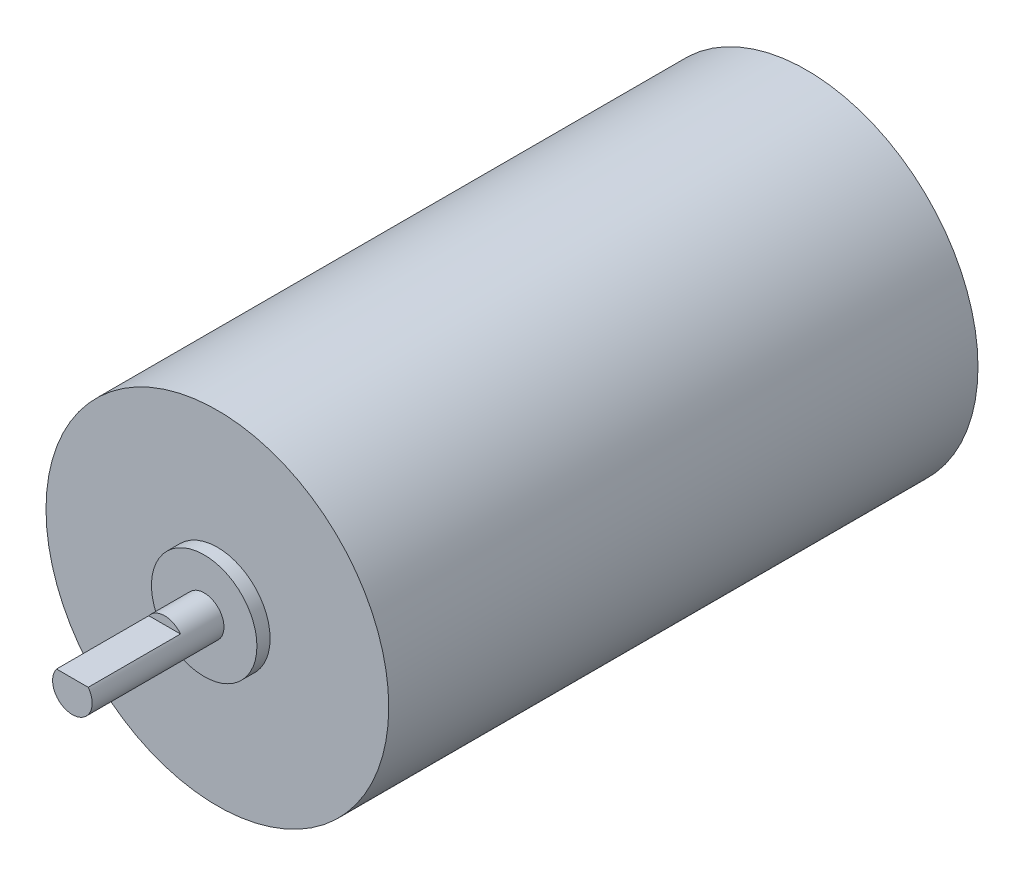
ISO-10303-21;
HEADER;
FILE_DESCRIPTION(('STEP AP214'),'2;1');
FILE_NAME('part.step','',(''),(''),'','','');
FILE_SCHEMA(('AUTOMOTIVE_DESIGN { 1 0 10303 214 1 1 1 1 }'));
ENDSEC;
DATA;
#1=APPLICATION_CONTEXT('core data for automotive mechanical design processes');
#2=APPLICATION_PROTOCOL_DEFINITION('international standard','automotive_design',2000,#1);
#3=PRODUCT_CONTEXT('',#1,'mechanical');
#4=PRODUCT('Part','Part','',(#3));
#5=PRODUCT_RELATED_PRODUCT_CATEGORY('part','',(#4));
#6=PRODUCT_DEFINITION_FORMATION('','',#4);
#7=PRODUCT_DEFINITION_CONTEXT('part definition',#1,'design');
#8=PRODUCT_DEFINITION('design','',#6,#7);
#9=PRODUCT_DEFINITION_SHAPE('','',#8);
#10=(LENGTH_UNIT() NAMED_UNIT(*) SI_UNIT(.MILLI.,.METRE.));
#11=(NAMED_UNIT(*) PLANE_ANGLE_UNIT() SI_UNIT($,.RADIAN.));
#12=(NAMED_UNIT(*) SI_UNIT($,.STERADIAN.) SOLID_ANGLE_UNIT());
#13=UNCERTAINTY_MEASURE_WITH_UNIT(LENGTH_MEASURE(1.E-05),#10,'distance_accuracy_value','');
#14=(GEOMETRIC_REPRESENTATION_CONTEXT(3) GLOBAL_UNCERTAINTY_ASSIGNED_CONTEXT((#13)) GLOBAL_UNIT_ASSIGNED_CONTEXT((#10,
#11,#12)) REPRESENTATION_CONTEXT('',''));
#15=CARTESIAN_POINT('',(0.,0.,0.));
#16=DIRECTION('',(0.,0.,1.));
#17=DIRECTION('',(1.,0.,0.));
#18=AXIS2_PLACEMENT_3D('',#15,#16,#17);
#19=CARTESIAN_POINT('',(0.,0.,45.7));
#20=DIRECTION('',(0.,0.,1.));
#21=DIRECTION('',(1.,0.,0.));
#22=AXIS2_PLACEMENT_3D('',#19,#20,#21);
#23=PLANE('',#22);
#24=CARTESIAN_POINT('',(0.,0.,45.7));
#25=DIRECTION('',(0.,0.,1.));
#26=DIRECTION('',(1.,0.,0.));
#27=AXIS2_PLACEMENT_3D('',#24,#25,#26);
#28=CIRCLE('',#27,4.);
#29=CARTESIAN_POINT('',(4.,0.,45.7));
#30=VERTEX_POINT('',#29);
#31=EDGE_CURVE('E77',#30,#30,#28,.T.);
#32=ORIENTED_EDGE('',*,*,#31,.T.);
#33=EDGE_LOOP('',(#32));
#34=FACE_BOUND('',#33,.T.);
#35=CARTESIAN_POINT('',(0.,0.,45.7));
#36=DIRECTION('',(0.,0.,1.));
#37=DIRECTION('',(1.,0.,0.));
#38=AXIS2_PLACEMENT_3D('',#35,#36,#37);
#39=CIRCLE('',#38,1.5);
#40=CARTESIAN_POINT('',(1.5,0.,45.7));
#41=VERTEX_POINT('',#40);
#42=EDGE_CURVE('E71',#41,#41,#39,.T.);
#43=ORIENTED_EDGE('',*,*,#42,.F.);
#44=EDGE_LOOP('',(#43));
#45=FACE_BOUND('',#44,.T.);
#46=ADVANCED_FACE('F33',(#34,#45),#23,.T.);
#47=CARTESIAN_POINT('',(0.,0.,44.7));
#48=DIRECTION('',(0.,0.,1.));
#49=DIRECTION('',(1.,0.,0.));
#50=AXIS2_PLACEMENT_3D('',#47,#48,#49);
#51=PLANE('',#50);
#52=CARTESIAN_POINT('',(0.,0.,44.7));
#53=DIRECTION('',(0.,0.,1.));
#54=DIRECTION('',(1.,0.,0.));
#55=AXIS2_PLACEMENT_3D('',#52,#53,#54);
#56=CIRCLE('',#55,13.);
#57=CARTESIAN_POINT('',(-13.,0.,44.7));
#58=VERTEX_POINT('',#57);
#59=EDGE_CURVE('E11',#58,#58,#56,.T.);
#60=ORIENTED_EDGE('',*,*,#59,.T.);
#61=EDGE_LOOP('',(#60));
#62=FACE_BOUND('',#61,.T.);
#63=CARTESIAN_POINT('',(0.,0.,44.7));
#64=DIRECTION('',(0.,0.,1.));
#65=DIRECTION('',(1.,0.,0.));
#66=AXIS2_PLACEMENT_3D('',#63,#64,#65);
#67=CIRCLE('',#66,4.);
#68=CARTESIAN_POINT('',(4.,0.,44.7));
#69=VERTEX_POINT('',#68);
#70=EDGE_CURVE('E74',#69,#69,#67,.T.);
#71=ORIENTED_EDGE('',*,*,#70,.F.);
#72=EDGE_LOOP('',(#71));
#73=FACE_BOUND('',#72,.T.);
#74=ADVANCED_FACE('F99',(#62,#73),#51,.T.);
#75=CARTESIAN_POINT('',(0.,0.,44.7));
#76=DIRECTION('',(0.,0.,-1.));
#77=DIRECTION('',(-1.,0.,0.));
#78=AXIS2_PLACEMENT_3D('',#75,#76,#77);
#79=CYLINDRICAL_SURFACE('',#78,13.);
#80=CARTESIAN_POINT('',(0.,0.,0.));
#81=DIRECTION('',(0.,0.,1.));
#82=DIRECTION('',(1.,0.,0.));
#83=AXIS2_PLACEMENT_3D('',#80,#81,#82);
#84=CIRCLE('',#83,13.);
#85=CARTESIAN_POINT('',(-13.,0.,0.));
#86=VERTEX_POINT('',#85);
#87=EDGE_CURVE('E37',#86,#86,#84,.T.);
#88=CARTESIAN_POINT('',(-13.,0.,44.7));
#89=CARTESIAN_POINT('',(-13.,0.,44.234375));
#90=CARTESIAN_POINT('',(-13.,0.,43.76875));
#91=CARTESIAN_POINT('',(-13.,0.,42.8375));
#92=CARTESIAN_POINT('',(-13.,0.,42.371875));
#93=CARTESIAN_POINT('',(-13.,0.,41.440625));
#94=CARTESIAN_POINT('',(-13.,0.,40.975));
#95=CARTESIAN_POINT('',(-13.,0.,40.04375));
#96=CARTESIAN_POINT('',(-13.,0.,39.578125));
#97=CARTESIAN_POINT('',(-13.,0.,38.646875));
#98=CARTESIAN_POINT('',(-13.,0.,38.18125));
#99=CARTESIAN_POINT('',(-13.,0.,37.25));
#100=CARTESIAN_POINT('',(-13.,0.,36.784375));
#101=CARTESIAN_POINT('',(-13.,0.,35.853125));
#102=CARTESIAN_POINT('',(-13.,0.,35.3875));
#103=CARTESIAN_POINT('',(-13.,0.,34.45625));
#104=CARTESIAN_POINT('',(-13.,0.,33.990625));
#105=CARTESIAN_POINT('',(-13.,0.,33.059375));
#106=CARTESIAN_POINT('',(-13.,0.,32.59375));
#107=CARTESIAN_POINT('',(-13.,0.,31.6625));
#108=CARTESIAN_POINT('',(-13.,0.,31.196875));
#109=CARTESIAN_POINT('',(-13.,0.,30.265625));
#110=CARTESIAN_POINT('',(-13.,0.,29.8));
#111=CARTESIAN_POINT('',(-13.,0.,28.86875));
#112=CARTESIAN_POINT('',(-13.,0.,28.403125));
#113=CARTESIAN_POINT('',(-13.,0.,27.471875));
#114=CARTESIAN_POINT('',(-13.,0.,27.00625));
#115=CARTESIAN_POINT('',(-13.,0.,26.075));
#116=CARTESIAN_POINT('',(-13.,0.,25.609375));
#117=CARTESIAN_POINT('',(-13.,0.,24.678125));
#118=CARTESIAN_POINT('',(-13.,0.,24.2125));
#119=CARTESIAN_POINT('',(-13.,0.,23.28125));
#120=CARTESIAN_POINT('',(-13.,0.,22.815625));
#121=CARTESIAN_POINT('',(-13.,0.,21.884375));
#122=CARTESIAN_POINT('',(-13.,0.,21.41875));
#123=CARTESIAN_POINT('',(-13.,0.,20.4875));
#124=CARTESIAN_POINT('',(-13.,0.,20.021875));
#125=CARTESIAN_POINT('',(-13.,0.,19.090625));
#126=CARTESIAN_POINT('',(-13.,0.,18.625));
#127=CARTESIAN_POINT('',(-13.,0.,17.69375));
#128=CARTESIAN_POINT('',(-13.,0.,17.228125));
#129=CARTESIAN_POINT('',(-13.,0.,16.296875));
#130=CARTESIAN_POINT('',(-13.,0.,15.83125));
#131=CARTESIAN_POINT('',(-13.,0.,14.9));
#132=CARTESIAN_POINT('',(-13.,0.,14.434375));
#133=CARTESIAN_POINT('',(-13.,0.,13.503125));
#134=CARTESIAN_POINT('',(-13.,0.,13.0375));
#135=CARTESIAN_POINT('',(-13.,0.,12.10625));
#136=CARTESIAN_POINT('',(-13.,0.,11.640625));
#137=CARTESIAN_POINT('',(-13.,0.,10.709375));
#138=CARTESIAN_POINT('',(-13.,0.,10.24375));
#139=CARTESIAN_POINT('',(-13.,0.,9.3125));
#140=CARTESIAN_POINT('',(-13.,0.,8.846875));
#141=CARTESIAN_POINT('',(-13.,0.,7.91562499999999));
#142=CARTESIAN_POINT('',(-13.,0.,7.44999999999999));
#143=CARTESIAN_POINT('',(-13.,0.,6.51874999999999));
#144=CARTESIAN_POINT('',(-13.,0.,6.053125));
#145=CARTESIAN_POINT('',(-13.,0.,5.121875));
#146=CARTESIAN_POINT('',(-13.,0.,4.65625));
#147=CARTESIAN_POINT('',(-13.,0.,3.72499999999999));
#148=CARTESIAN_POINT('',(-13.,0.,3.25937499999999));
#149=CARTESIAN_POINT('',(-13.,0.,2.32812499999999));
#150=CARTESIAN_POINT('',(-13.,0.,1.86249999999999));
#151=CARTESIAN_POINT('',(-13.,0.,0.931249999999992));
#152=CARTESIAN_POINT('',(-13.,0.,0.465624999999992));
#153=CARTESIAN_POINT('',(-13.,0.,0.));
#154=B_SPLINE_CURVE_WITH_KNOTS('',3,(#88,#89,#90,#91,#92,#93,#94,#95,#96,#97,#98,#99,#100,#101,
#102,#103,#104,#105,#106,#107,#108,#109,#110,#111,#112,#113,#114,#115,#116,#117,#118,#119,#120,
#121,#122,#123,#124,#125,#126,#127,#128,#129,#130,#131,#132,#133,#134,#135,#136,#137,#138,#139,
#140,#141,#142,#143,#144,#145,#146,#147,#148,#149,#150,#151,#152,#153),.UNSPECIFIED.,.F.,.F.,(4,
2,2,2,2,2,2,2,2,2,2,2,2,2,2,2,2,2,2,2,2,2,2,2,2,2,2,2,2,2,2,2,4),(0.,1.396875,2.79375,4.190625,
5.5875,6.98437499999999,8.38125,9.778125,11.175,12.571875,13.96875,15.365625,16.7625,18.159375,
19.55625,20.953125,22.35,23.746875,25.14375,26.540625,27.9375,29.334375,30.73125,32.128125,
33.525,34.921875,36.31875,37.715625,39.1125,40.509375,41.90625,43.303125,44.7),.UNSPECIFIED.);
#155=EDGE_CURVE('BSEAM35',#58,#86,#154,.T.);
#156=ORIENTED_EDGE('',*,*,#59,.F.);
#157=ORIENTED_EDGE('',*,*,#87,.T.);
#158=ORIENTED_EDGE('',*,*,#155,.T.);
#159=ORIENTED_EDGE('',*,*,#155,.F.);
#160=EDGE_LOOP('',(#156,#158,#157,#159));
#161=FACE_BOUND('',#160,.T.);
#162=ADVANCED_FACE('F35',(#161),#79,.T.);
#163=CARTESIAN_POINT('',(0.,0.,0.));
#164=DIRECTION('',(0.,0.,1.));
#165=DIRECTION('',(1.,0.,0.));
#166=AXIS2_PLACEMENT_3D('',#163,#164,#165);
#167=PLANE('',#166);
#168=ORIENTED_EDGE('',*,*,#87,.F.);
#169=EDGE_LOOP('',(#168));
#170=FACE_BOUND('',#169,.T.);
#171=ADVANCED_FACE('F90',(#170),#167,.F.);
#172=CARTESIAN_POINT('',(0.,0.,45.7));
#173=DIRECTION('',(0.,0.,-1.));
#174=DIRECTION('',(-1.,0.,0.));
#175=AXIS2_PLACEMENT_3D('',#172,#173,#174);
#176=CYLINDRICAL_SURFACE('',#175,4.);
#177=ORIENTED_EDGE('',*,*,#31,.F.);
#178=EDGE_LOOP('',(#177));
#179=FACE_BOUND('',#178,.T.);
#180=ORIENTED_EDGE('',*,*,#70,.T.);
#181=EDGE_LOOP('',(#180));
#182=FACE_BOUND('',#181,.T.);
#183=ADVANCED_FACE('F92',(#179,#182),#176,.T.);
#184=CARTESIAN_POINT('',(0.,0.,55.7));
#185=DIRECTION('',(0.,0.,-1.));
#186=DIRECTION('',(-1.,0.,0.));
#187=AXIS2_PLACEMENT_3D('',#184,#185,#186);
#188=CYLINDRICAL_SURFACE('',#187,1.5);
#189=CARTESIAN_POINT('',(0.,0.,55.7));
#190=DIRECTION('',(0.,0.,1.));
#191=DIRECTION('',(1.,0.,0.));
#192=AXIS2_PLACEMENT_3D('',#189,#190,#191);
#193=CIRCLE('',#192,1.5);
#194=CARTESIAN_POINT('',(-1.20090311835531,0.898794581828632,55.7));
#195=VERTEX_POINT('',#194);
#196=CARTESIAN_POINT('',(1.20090311835531,0.898794581828632,55.7));
#197=VERTEX_POINT('',#196);
#198=EDGE_CURVE('E70',#195,#197,#193,.T.);
#199=ORIENTED_EDGE('',*,*,#198,.F.);
#200=DIRECTION('',(0.,0.,1.));
#201=VECTOR('',#200,1.);
#202=CARTESIAN_POINT('',(-1.20090311835531,0.898794581828632,48.7));
#203=LINE('',#202,#201);
#204=CARTESIAN_POINT('',(-1.20090311835531,0.898794581828632,48.7));
#205=VERTEX_POINT('',#204);
#206=EDGE_CURVE('E48',#205,#195,#203,.T.);
#207=ORIENTED_EDGE('',*,*,#206,.F.);
#208=CARTESIAN_POINT('',(0.,0.,48.7));
#209=DIRECTION('',(0.,0.,1.));
#210=DIRECTION('',(-1.,0.,0.));
#211=AXIS2_PLACEMENT_3D('',#208,#209,#210);
#212=CIRCLE('',#211,1.5);
#213=CARTESIAN_POINT('',(1.20090311835531,0.898794581828632,48.7));
#214=VERTEX_POINT('',#213);
#215=EDGE_CURVE('E64',#214,#205,#212,.T.);
#216=ORIENTED_EDGE('',*,*,#215,.F.);
#217=DIRECTION('',(0.,0.,1.));
#218=VECTOR('',#217,1.);
#219=CARTESIAN_POINT('',(1.20090311835531,0.898794581828632,48.7));
#220=LINE('',#219,#218);
#221=EDGE_CURVE('E54',#214,#197,#220,.T.);
#222=ORIENTED_EDGE('',*,*,#221,.T.);
#223=EDGE_LOOP('',(#199,#207,#216,#222));
#224=FACE_BOUND('',#223,.T.);
#225=ORIENTED_EDGE('',*,*,#42,.T.);
#226=EDGE_LOOP('',(#225));
#227=FACE_BOUND('',#226,.T.);
#228=ADVANCED_FACE('F68',(#224,#227),#188,.T.);
#229=CARTESIAN_POINT('',(0.,0.,55.7));
#230=DIRECTION('',(0.,0.,1.));
#231=DIRECTION('',(1.,0.,0.));
#232=AXIS2_PLACEMENT_3D('',#229,#230,#231);
#233=PLANE('',#232);
#234=DIRECTION('',(1.,0.,0.));
#235=VECTOR('',#234,1.);
#236=CARTESIAN_POINT('',(-1.20090311835531,0.898794581828632,55.7));
#237=LINE('',#236,#235);
#238=EDGE_CURVE('E59',#195,#197,#237,.T.);
#239=ORIENTED_EDGE('',*,*,#238,.F.);
#240=ORIENTED_EDGE('',*,*,#198,.T.);
#241=EDGE_LOOP('',(#239,#240));
#242=FACE_BOUND('',#241,.T.);
#243=ADVANCED_FACE('F73',(#242),#233,.T.);
#244=CARTESIAN_POINT('',(-1.20090311835531,0.898794581828632,48.7));
#245=DIRECTION('',(0.,-1.,0.));
#246=DIRECTION('',(0.,0.,-1.));
#247=AXIS2_PLACEMENT_3D('',#244,#245,#246);
#248=PLANE('',#247);
#249=ORIENTED_EDGE('',*,*,#238,.T.);
#250=ORIENTED_EDGE('',*,*,#221,.F.);
#251=DIRECTION('',(1.,0.,0.));
#252=VECTOR('',#251,1.);
#253=CARTESIAN_POINT('',(-1.20090311835531,0.898794581828632,48.7));
#254=LINE('',#253,#252);
#255=EDGE_CURVE('E121',#205,#214,#254,.T.);
#256=ORIENTED_EDGE('',*,*,#255,.F.);
#257=ORIENTED_EDGE('',*,*,#206,.T.);
#258=EDGE_LOOP('',(#249,#250,#256,#257));
#259=FACE_BOUND('',#258,.T.);
#260=ADVANCED_FACE('F60',(#259),#248,.F.);
#261=CARTESIAN_POINT('',(0.,0.,48.7));
#262=DIRECTION('',(0.,0.,-1.));
#263=DIRECTION('',(-1.,0.,0.));
#264=AXIS2_PLACEMENT_3D('',#261,#262,#263);
#265=PLANE('',#264);
#266=ORIENTED_EDGE('',*,*,#215,.T.);
#267=ORIENTED_EDGE('',*,*,#255,.T.);
#268=EDGE_LOOP('',(#266,#267));
#269=FACE_BOUND('',#268,.T.);
#270=ADVANCED_FACE('F116',(#269),#265,.F.);
#271=CLOSED_SHELL('',(#46,#74,#162,#171,#183,#228,#243,#260,#270));
#272=MANIFOLD_SOLID_BREP('B2',#271);
#273=ADVANCED_BREP_SHAPE_REPRESENTATION('',(#18,#272),#14);
#274=SHAPE_DEFINITION_REPRESENTATION(#9,#273);
ENDSEC;
END-ISO-10303-21;
